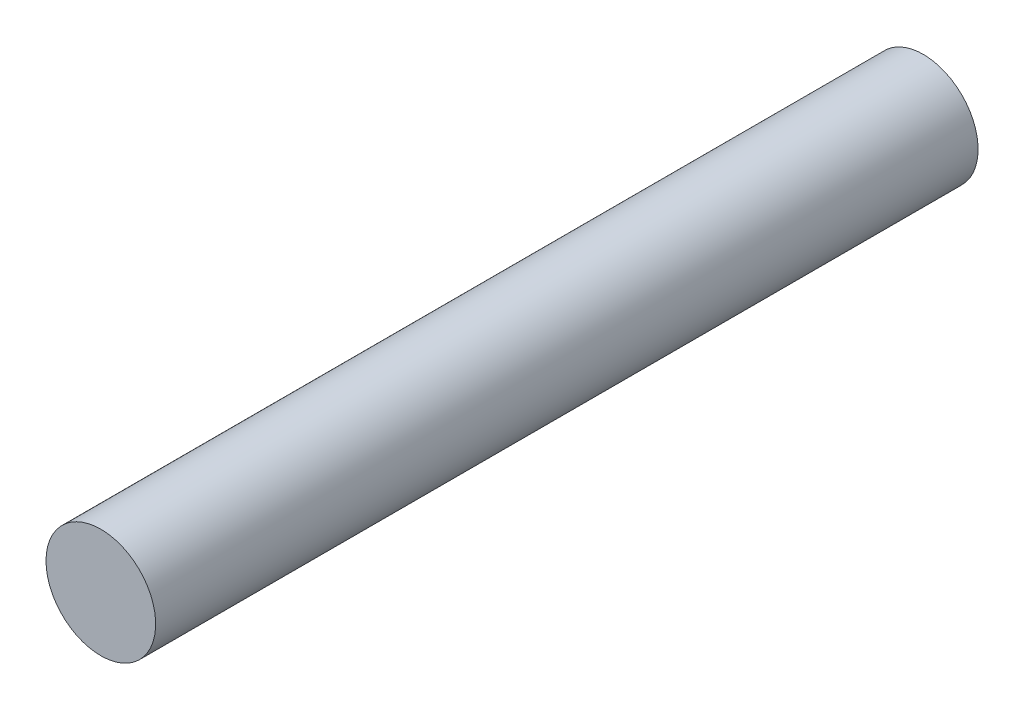
ISO-10303-21;
HEADER;
FILE_DESCRIPTION(('STEP AP214'),'2;1');
FILE_NAME('part.step','',(''),(''),'','','');
FILE_SCHEMA(('AUTOMOTIVE_DESIGN { 1 0 10303 214 1 1 1 1 }'));
ENDSEC;
DATA;
#1=APPLICATION_CONTEXT('core data for automotive mechanical design processes');
#2=APPLICATION_PROTOCOL_DEFINITION('international standard','automotive_design',2000,#1);
#3=PRODUCT_CONTEXT('',#1,'mechanical');
#4=PRODUCT('Part','Part','',(#3));
#5=PRODUCT_RELATED_PRODUCT_CATEGORY('part','',(#4));
#6=PRODUCT_DEFINITION_FORMATION('','',#4);
#7=PRODUCT_DEFINITION_CONTEXT('part definition',#1,'design');
#8=PRODUCT_DEFINITION('design','',#6,#7);
#9=PRODUCT_DEFINITION_SHAPE('','',#8);
#10=(LENGTH_UNIT() NAMED_UNIT(*) SI_UNIT(.MILLI.,.METRE.));
#11=(NAMED_UNIT(*) PLANE_ANGLE_UNIT() SI_UNIT($,.RADIAN.));
#12=(NAMED_UNIT(*) SI_UNIT($,.STERADIAN.) SOLID_ANGLE_UNIT());
#13=UNCERTAINTY_MEASURE_WITH_UNIT(LENGTH_MEASURE(1.E-05),#10,'distance_accuracy_value','');
#14=(GEOMETRIC_REPRESENTATION_CONTEXT(3) GLOBAL_UNCERTAINTY_ASSIGNED_CONTEXT((#13)) GLOBAL_UNIT_ASSIGNED_CONTEXT((#10,
#11,#12)) REPRESENTATION_CONTEXT('',''));
#15=CARTESIAN_POINT('',(0.,0.,0.));
#16=DIRECTION('',(0.,0.,1.));
#17=DIRECTION('',(1.,0.,0.));
#18=AXIS2_PLACEMENT_3D('',#15,#16,#17);
#19=CARTESIAN_POINT('',(0.,0.,45.));
#20=DIRECTION('',(0.,0.,-1.));
#21=DIRECTION('',(-1.,0.,0.));
#22=AXIS2_PLACEMENT_3D('',#19,#20,#21);
#23=CYLINDRICAL_SURFACE('',#22,3.);
#24=CARTESIAN_POINT('',(0.,0.,45.));
#25=DIRECTION('',(0.,0.,1.));
#26=DIRECTION('',(1.,0.,0.));
#27=AXIS2_PLACEMENT_3D('',#24,#25,#26);
#28=CIRCLE('',#27,3.);
#29=CARTESIAN_POINT('',(-3.,0.,45.));
#30=VERTEX_POINT('',#29);
#31=EDGE_CURVE('E10',#30,#30,#28,.T.);
#32=CARTESIAN_POINT('',(0.,0.,0.));
#33=DIRECTION('',(0.,0.,1.));
#34=DIRECTION('',(1.,0.,0.));
#35=AXIS2_PLACEMENT_3D('',#32,#33,#34);
#36=CIRCLE('',#35,3.);
#37=CARTESIAN_POINT('',(-3.,0.,0.));
#38=VERTEX_POINT('',#37);
#39=EDGE_CURVE('E32',#38,#38,#36,.T.);
#40=CARTESIAN_POINT('',(-3.,0.,45.));
#41=CARTESIAN_POINT('',(-3.,0.,44.53125));
#42=CARTESIAN_POINT('',(-3.,0.,44.0625));
#43=CARTESIAN_POINT('',(-3.,0.,43.125));
#44=CARTESIAN_POINT('',(-3.,0.,42.65625));
#45=CARTESIAN_POINT('',(-3.,0.,41.71875));
#46=CARTESIAN_POINT('',(-3.,0.,41.25));
#47=CARTESIAN_POINT('',(-3.,0.,40.3125));
#48=CARTESIAN_POINT('',(-3.,0.,39.84375));
#49=CARTESIAN_POINT('',(-3.,0.,38.90625));
#50=CARTESIAN_POINT('',(-3.,0.,38.4375));
#51=CARTESIAN_POINT('',(-3.,0.,37.5));
#52=CARTESIAN_POINT('',(-3.,0.,37.03125));
#53=CARTESIAN_POINT('',(-3.,0.,36.09375));
#54=CARTESIAN_POINT('',(-3.,0.,35.625));
#55=CARTESIAN_POINT('',(-3.,0.,34.6875));
#56=CARTESIAN_POINT('',(-3.,0.,34.21875));
#57=CARTESIAN_POINT('',(-3.,0.,33.28125));
#58=CARTESIAN_POINT('',(-3.,0.,32.8125));
#59=CARTESIAN_POINT('',(-3.,0.,31.875));
#60=CARTESIAN_POINT('',(-3.,0.,31.40625));
#61=CARTESIAN_POINT('',(-3.,0.,30.46875));
#62=CARTESIAN_POINT('',(-3.,0.,30.));
#63=CARTESIAN_POINT('',(-3.,0.,29.0625));
#64=CARTESIAN_POINT('',(-3.,0.,28.59375));
#65=CARTESIAN_POINT('',(-3.,0.,27.65625));
#66=CARTESIAN_POINT('',(-3.,0.,27.1875));
#67=CARTESIAN_POINT('',(-3.,0.,26.25));
#68=CARTESIAN_POINT('',(-3.,0.,25.78125));
#69=CARTESIAN_POINT('',(-3.,0.,24.84375));
#70=CARTESIAN_POINT('',(-3.,0.,24.375));
#71=CARTESIAN_POINT('',(-3.,0.,23.4375));
#72=CARTESIAN_POINT('',(-3.,0.,22.96875));
#73=CARTESIAN_POINT('',(-3.,0.,22.03125));
#74=CARTESIAN_POINT('',(-3.,0.,21.5625));
#75=CARTESIAN_POINT('',(-3.,0.,20.625));
#76=CARTESIAN_POINT('',(-3.,0.,20.15625));
#77=CARTESIAN_POINT('',(-3.,0.,19.21875));
#78=CARTESIAN_POINT('',(-3.,0.,18.75));
#79=CARTESIAN_POINT('',(-3.,0.,17.8125));
#80=CARTESIAN_POINT('',(-3.,0.,17.34375));
#81=CARTESIAN_POINT('',(-3.,0.,16.40625));
#82=CARTESIAN_POINT('',(-3.,0.,15.9375));
#83=CARTESIAN_POINT('',(-3.,0.,15.));
#84=CARTESIAN_POINT('',(-3.,0.,14.53125));
#85=CARTESIAN_POINT('',(-3.,0.,13.59375));
#86=CARTESIAN_POINT('',(-3.,0.,13.125));
#87=CARTESIAN_POINT('',(-3.,0.,12.1875));
#88=CARTESIAN_POINT('',(-3.,0.,11.71875));
#89=CARTESIAN_POINT('',(-3.,0.,10.78125));
#90=CARTESIAN_POINT('',(-3.,0.,10.3125));
#91=CARTESIAN_POINT('',(-3.,0.,9.375));
#92=CARTESIAN_POINT('',(-3.,0.,8.90625));
#93=CARTESIAN_POINT('',(-3.,0.,7.96874999999999));
#94=CARTESIAN_POINT('',(-3.,0.,7.5));
#95=CARTESIAN_POINT('',(-3.,0.,6.5625));
#96=CARTESIAN_POINT('',(-3.,0.,6.09375));
#97=CARTESIAN_POINT('',(-3.,0.,5.15625));
#98=CARTESIAN_POINT('',(-3.,0.,4.68749999999999));
#99=CARTESIAN_POINT('',(-3.,0.,3.74999999999999));
#100=CARTESIAN_POINT('',(-3.,0.,3.28124999999999));
#101=CARTESIAN_POINT('',(-3.,0.,2.34374999999999));
#102=CARTESIAN_POINT('',(-3.,0.,1.87499999999999));
#103=CARTESIAN_POINT('',(-3.,0.,0.937499999999992));
#104=CARTESIAN_POINT('',(-3.,0.,0.468749999999993));
#105=CARTESIAN_POINT('',(-3.,0.,0.));
#106=B_SPLINE_CURVE_WITH_KNOTS('',3,(#40,#41,#42,#43,#44,#45,#46,#47,#48,#49,#50,#51,#52,#53,
#54,#55,#56,#57,#58,#59,#60,#61,#62,#63,#64,#65,#66,#67,#68,#69,#70,#71,#72,#73,#74,#75,#76,#77,
#78,#79,#80,#81,#82,#83,#84,#85,#86,#87,#88,#89,#90,#91,#92,#93,#94,#95,#96,#97,#98,#99,#100,
#101,#102,#103,#104,#105),.UNSPECIFIED.,.F.,.F.,(4,2,2,2,2,2,2,2,2,2,2,2,2,2,2,2,2,2,2,2,2,2,2,
2,2,2,2,2,2,2,2,2,4),(0.,1.40625,2.8125,4.21875000000001,5.62500000000001,7.03125,8.4375,
9.84375000000001,11.25,12.65625,14.0625,15.46875,16.875,18.28125,19.6875,21.09375,22.5,23.90625,
25.3125,26.71875,28.125,29.53125,30.9375,32.34375,33.75,35.15625,36.5625,37.96875,39.375,
40.78125,42.1875,43.59375,45.),.UNSPECIFIED.);
#107=EDGE_CURVE('BSEAM29',#30,#38,#106,.T.);
#108=ORIENTED_EDGE('',*,*,#31,.F.);
#109=ORIENTED_EDGE('',*,*,#39,.T.);
#110=ORIENTED_EDGE('',*,*,#107,.T.);
#111=ORIENTED_EDGE('',*,*,#107,.F.);
#112=EDGE_LOOP('',(#108,#110,#109,#111));
#113=FACE_BOUND('',#112,.T.);
#114=ADVANCED_FACE('F29',(#113),#23,.T.);
#115=CARTESIAN_POINT('',(0.,0.,45.));
#116=DIRECTION('',(0.,0.,1.));
#117=DIRECTION('',(1.,0.,0.));
#118=AXIS2_PLACEMENT_3D('',#115,#116,#117);
#119=PLANE('',#118);
#120=ORIENTED_EDGE('',*,*,#31,.T.);
#121=EDGE_LOOP('',(#120));
#122=FACE_BOUND('',#121,.T.);
#123=ADVANCED_FACE('F44',(#122),#119,.T.);
#124=CARTESIAN_POINT('',(0.,0.,0.));
#125=DIRECTION('',(0.,0.,1.));
#126=DIRECTION('',(1.,0.,0.));
#127=AXIS2_PLACEMENT_3D('',#124,#125,#126);
#128=PLANE('',#127);
#129=ORIENTED_EDGE('',*,*,#39,.F.);
#130=EDGE_LOOP('',(#129));
#131=FACE_BOUND('',#130,.T.);
#132=ADVANCED_FACE('F42',(#131),#128,.F.);
#133=CLOSED_SHELL('',(#114,#123,#132));
#134=MANIFOLD_SOLID_BREP('B2',#133);
#135=ADVANCED_BREP_SHAPE_REPRESENTATION('',(#18,#134),#14);
#136=SHAPE_DEFINITION_REPRESENTATION(#9,#135);
ENDSEC;
END-ISO-10303-21;
